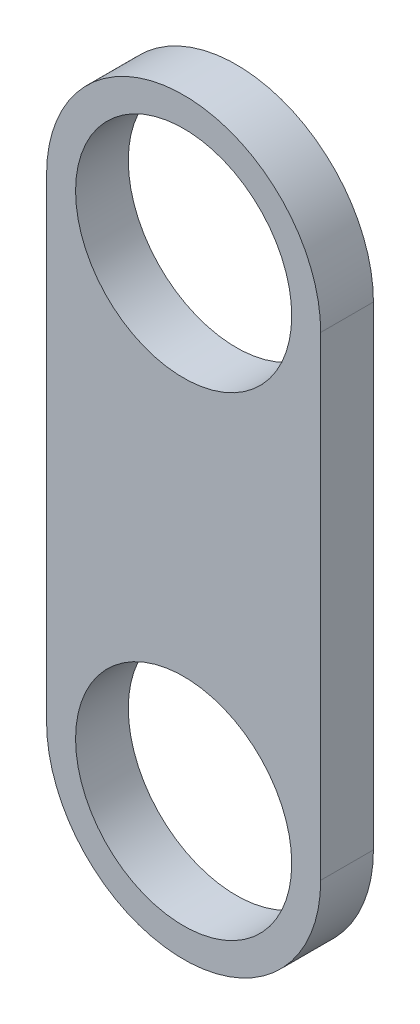
ISO-10303-21;
HEADER;
FILE_DESCRIPTION(('STEP AP214'),'2;1');
FILE_NAME('part.step','',(''),(''),'','','');
FILE_SCHEMA(('AUTOMOTIVE_DESIGN { 1 0 10303 214 1 1 1 1 }'));
ENDSEC;
DATA;
#1=APPLICATION_CONTEXT('core data for automotive mechanical design processes');
#2=APPLICATION_PROTOCOL_DEFINITION('international standard','automotive_design',2000,#1);
#3=PRODUCT_CONTEXT('',#1,'mechanical');
#4=PRODUCT('Part','Part','',(#3));
#5=PRODUCT_RELATED_PRODUCT_CATEGORY('part','',(#4));
#6=PRODUCT_DEFINITION_FORMATION('','',#4);
#7=PRODUCT_DEFINITION_CONTEXT('part definition',#1,'design');
#8=PRODUCT_DEFINITION('design','',#6,#7);
#9=PRODUCT_DEFINITION_SHAPE('','',#8);
#10=(LENGTH_UNIT() NAMED_UNIT(*) SI_UNIT(.MILLI.,.METRE.));
#11=(NAMED_UNIT(*) PLANE_ANGLE_UNIT() SI_UNIT($,.RADIAN.));
#12=(NAMED_UNIT(*) SI_UNIT($,.STERADIAN.) SOLID_ANGLE_UNIT());
#13=UNCERTAINTY_MEASURE_WITH_UNIT(LENGTH_MEASURE(1.E-05),#10,'distance_accuracy_value','');
#14=(GEOMETRIC_REPRESENTATION_CONTEXT(3) GLOBAL_UNCERTAINTY_ASSIGNED_CONTEXT((#13)) GLOBAL_UNIT_ASSIGNED_CONTEXT((#10,
#11,#12)) REPRESENTATION_CONTEXT('',''));
#15=CARTESIAN_POINT('',(0.,0.,0.));
#16=DIRECTION('',(0.,0.,1.));
#17=DIRECTION('',(1.,0.,0.));
#18=AXIS2_PLACEMENT_3D('',#15,#16,#17);
#19=CARTESIAN_POINT('',(-13.,0.,5.));
#20=DIRECTION('',(1.,0.,0.));
#21=DIRECTION('',(0.,1.,0.));
#22=AXIS2_PLACEMENT_3D('',#19,#20,#21);
#23=PLANE('',#22);
#24=DIRECTION('',(0.,-1.,0.));
#25=VECTOR('',#24,1.);
#26=CARTESIAN_POINT('',(-13.,0.,0.));
#27=LINE('',#26,#25);
#28=CARTESIAN_POINT('',(-13.,0.,0.));
#29=VERTEX_POINT('',#28);
#30=CARTESIAN_POINT('',(-13.,-45.,0.));
#31=VERTEX_POINT('',#30);
#32=EDGE_CURVE('E114',#29,#31,#27,.T.);
#33=ORIENTED_EDGE('',*,*,#32,.T.);
#34=DIRECTION('',(0.,0.,-1.));
#35=VECTOR('',#34,1.);
#36=CARTESIAN_POINT('',(-13.,-45.,5.));
#37=LINE('',#36,#35);
#38=CARTESIAN_POINT('',(-13.,-45.,5.));
#39=VERTEX_POINT('',#38);
#40=EDGE_CURVE('E11',#39,#31,#37,.T.);
#41=ORIENTED_EDGE('',*,*,#40,.F.);
#42=DIRECTION('',(0.,-1.,0.));
#43=VECTOR('',#42,1.);
#44=CARTESIAN_POINT('',(-13.,0.,5.));
#45=LINE('',#44,#43);
#46=CARTESIAN_POINT('',(-13.,0.,5.));
#47=VERTEX_POINT('',#46);
#48=EDGE_CURVE('E93',#47,#39,#45,.T.);
#49=ORIENTED_EDGE('',*,*,#48,.F.);
#50=DIRECTION('',(0.,0.,-1.));
#51=VECTOR('',#50,1.);
#52=CARTESIAN_POINT('',(-13.,0.,5.));
#53=LINE('',#52,#51);
#54=EDGE_CURVE('E104',#47,#29,#53,.T.);
#55=ORIENTED_EDGE('',*,*,#54,.T.);
#56=EDGE_LOOP('',(#33,#41,#49,#55));
#57=FACE_BOUND('',#56,.T.);
#58=ADVANCED_FACE('F45',(#57),#23,.F.);
#59=CARTESIAN_POINT('',(0.,-45.,5.));
#60=DIRECTION('',(0.,0.,-1.));
#61=DIRECTION('',(-1.,0.,0.));
#62=AXIS2_PLACEMENT_3D('',#59,#60,#61);
#63=CYLINDRICAL_SURFACE('',#62,13.);
#64=CARTESIAN_POINT('',(0.,-45.,0.));
#65=DIRECTION('',(0.,0.,1.));
#66=DIRECTION('',(1.,0.,0.));
#67=AXIS2_PLACEMENT_3D('',#64,#65,#66);
#68=CIRCLE('',#67,13.);
#69=CARTESIAN_POINT('',(13.,-45.,0.));
#70=VERTEX_POINT('',#69);
#71=EDGE_CURVE('E98',#31,#70,#68,.T.);
#72=ORIENTED_EDGE('',*,*,#71,.T.);
#73=DIRECTION('',(0.,0.,-1.));
#74=VECTOR('',#73,1.);
#75=CARTESIAN_POINT('',(13.,-45.,5.));
#76=LINE('',#75,#74);
#77=CARTESIAN_POINT('',(13.,-45.,5.));
#78=VERTEX_POINT('',#77);
#79=EDGE_CURVE('E54',#78,#70,#76,.T.);
#80=ORIENTED_EDGE('',*,*,#79,.F.);
#81=CARTESIAN_POINT('',(0.,-45.,5.));
#82=DIRECTION('',(0.,0.,1.));
#83=DIRECTION('',(1.,0.,0.));
#84=AXIS2_PLACEMENT_3D('',#81,#82,#83);
#85=CIRCLE('',#84,13.);
#86=EDGE_CURVE('E88',#39,#78,#85,.T.);
#87=ORIENTED_EDGE('',*,*,#86,.F.);
#88=ORIENTED_EDGE('',*,*,#40,.T.);
#89=EDGE_LOOP('',(#72,#80,#87,#88));
#90=FACE_BOUND('',#89,.T.);
#91=ADVANCED_FACE('F97',(#90),#63,.T.);
#92=CARTESIAN_POINT('',(13.,0.,5.));
#93=DIRECTION('',(1.,0.,0.));
#94=DIRECTION('',(0.,1.,0.));
#95=AXIS2_PLACEMENT_3D('',#92,#93,#94);
#96=PLANE('',#95);
#97=DIRECTION('',(0.,-1.,0.));
#98=VECTOR('',#97,1.);
#99=CARTESIAN_POINT('',(13.,0.,0.));
#100=LINE('',#99,#98);
#101=CARTESIAN_POINT('',(13.,0.,0.));
#102=VERTEX_POINT('',#101);
#103=EDGE_CURVE('E118',#102,#70,#100,.T.);
#104=ORIENTED_EDGE('',*,*,#103,.F.);
#105=DIRECTION('',(0.,0.,-1.));
#106=VECTOR('',#105,1.);
#107=CARTESIAN_POINT('',(13.,0.,5.));
#108=LINE('',#107,#106);
#109=CARTESIAN_POINT('',(13.,0.,5.));
#110=VERTEX_POINT('',#109);
#111=EDGE_CURVE('E78',#110,#102,#108,.T.);
#112=ORIENTED_EDGE('',*,*,#111,.F.);
#113=DIRECTION('',(0.,-1.,0.));
#114=VECTOR('',#113,1.);
#115=CARTESIAN_POINT('',(13.,0.,5.));
#116=LINE('',#115,#114);
#117=EDGE_CURVE('E91',#110,#78,#116,.T.);
#118=ORIENTED_EDGE('',*,*,#117,.T.);
#119=ORIENTED_EDGE('',*,*,#79,.T.);
#120=EDGE_LOOP('',(#104,#112,#118,#119));
#121=FACE_BOUND('',#120,.T.);
#122=ADVANCED_FACE('F102',(#121),#96,.T.);
#123=CARTESIAN_POINT('',(0.,0.,5.));
#124=DIRECTION('',(0.,0.,-1.));
#125=DIRECTION('',(-1.,0.,0.));
#126=AXIS2_PLACEMENT_3D('',#123,#124,#125);
#127=CYLINDRICAL_SURFACE('',#126,10.25);
#128=CARTESIAN_POINT('',(0.,0.,5.));
#129=DIRECTION('',(0.,0.,1.));
#130=DIRECTION('',(1.,0.,0.));
#131=AXIS2_PLACEMENT_3D('',#128,#129,#130);
#132=CIRCLE('',#131,10.25);
#133=CARTESIAN_POINT('',(10.25,0.,5.));
#134=VERTEX_POINT('',#133);
#135=EDGE_CURVE('E156',#134,#134,#132,.T.);
#136=ORIENTED_EDGE('',*,*,#135,.T.);
#137=EDGE_LOOP('',(#136));
#138=FACE_BOUND('',#137,.T.);
#139=CARTESIAN_POINT('',(0.,0.,0.));
#140=DIRECTION('',(0.,0.,1.));
#141=DIRECTION('',(1.,0.,0.));
#142=AXIS2_PLACEMENT_3D('',#139,#140,#141);
#143=CIRCLE('',#142,10.25);
#144=CARTESIAN_POINT('',(10.25,0.,0.));
#145=VERTEX_POINT('',#144);
#146=EDGE_CURVE('E111',#145,#145,#143,.T.);
#147=ORIENTED_EDGE('',*,*,#146,.F.);
#148=EDGE_LOOP('',(#147));
#149=FACE_BOUND('',#148,.T.);
#150=ADVANCED_FACE('F145',(#138,#149),#127,.F.);
#151=CARTESIAN_POINT('',(0.,-45.,5.));
#152=DIRECTION('',(0.,0.,-1.));
#153=DIRECTION('',(-1.,0.,0.));
#154=AXIS2_PLACEMENT_3D('',#151,#152,#153);
#155=CYLINDRICAL_SURFACE('',#154,10.25);
#156=CARTESIAN_POINT('',(0.,-45.,5.));
#157=DIRECTION('',(0.,0.,1.));
#158=DIRECTION('',(1.,0.,0.));
#159=AXIS2_PLACEMENT_3D('',#156,#157,#158);
#160=CIRCLE('',#159,10.25);
#161=CARTESIAN_POINT('',(10.25,-45.,5.));
#162=VERTEX_POINT('',#161);
#163=EDGE_CURVE('E121',#162,#162,#160,.T.);
#164=ORIENTED_EDGE('',*,*,#163,.T.);
#165=EDGE_LOOP('',(#164));
#166=FACE_BOUND('',#165,.T.);
#167=CARTESIAN_POINT('',(0.,-45.,0.));
#168=DIRECTION('',(0.,0.,1.));
#169=DIRECTION('',(1.,0.,0.));
#170=AXIS2_PLACEMENT_3D('',#167,#168,#169);
#171=CIRCLE('',#170,10.25);
#172=CARTESIAN_POINT('',(10.25,-45.,0.));
#173=VERTEX_POINT('',#172);
#174=EDGE_CURVE('E108',#173,#173,#171,.T.);
#175=ORIENTED_EDGE('',*,*,#174,.F.);
#176=EDGE_LOOP('',(#175));
#177=FACE_BOUND('',#176,.T.);
#178=ADVANCED_FACE('F47',(#166,#177),#155,.F.);
#179=CARTESIAN_POINT('',(0.,0.,5.));
#180=DIRECTION('',(0.,0.,-1.));
#181=DIRECTION('',(-1.,0.,0.));
#182=AXIS2_PLACEMENT_3D('',#179,#180,#181);
#183=CYLINDRICAL_SURFACE('',#182,13.);
#184=CARTESIAN_POINT('',(0.,0.,0.));
#185=DIRECTION('',(0.,0.,1.));
#186=DIRECTION('',(1.,0.,0.));
#187=AXIS2_PLACEMENT_3D('',#184,#185,#186);
#188=CIRCLE('',#187,13.);
#189=EDGE_CURVE('E81',#102,#29,#188,.T.);
#190=ORIENTED_EDGE('',*,*,#189,.T.);
#191=ORIENTED_EDGE('',*,*,#54,.F.);
#192=CARTESIAN_POINT('',(0.,0.,5.));
#193=DIRECTION('',(0.,0.,1.));
#194=DIRECTION('',(1.,0.,0.));
#195=AXIS2_PLACEMENT_3D('',#192,#193,#194);
#196=CIRCLE('',#195,13.);
#197=EDGE_CURVE('E62',#110,#47,#196,.T.);
#198=ORIENTED_EDGE('',*,*,#197,.F.);
#199=ORIENTED_EDGE('',*,*,#111,.T.);
#200=EDGE_LOOP('',(#190,#191,#198,#199));
#201=FACE_BOUND('',#200,.T.);
#202=ADVANCED_FACE('F133',(#201),#183,.T.);
#203=CARTESIAN_POINT('',(0.,0.,5.));
#204=DIRECTION('',(0.,0.,1.));
#205=DIRECTION('',(1.,0.,0.));
#206=AXIS2_PLACEMENT_3D('',#203,#204,#205);
#207=PLANE('',#206);
#208=ORIENTED_EDGE('',*,*,#163,.F.);
#209=EDGE_LOOP('',(#208));
#210=FACE_BOUND('',#209,.T.);
#211=ORIENTED_EDGE('',*,*,#135,.F.);
#212=EDGE_LOOP('',(#211));
#213=FACE_BOUND('',#212,.T.);
#214=ORIENTED_EDGE('',*,*,#48,.T.);
#215=ORIENTED_EDGE('',*,*,#86,.T.);
#216=ORIENTED_EDGE('',*,*,#117,.F.);
#217=ORIENTED_EDGE('',*,*,#197,.T.);
#218=EDGE_LOOP('',(#214,#215,#216,#217));
#219=FACE_BOUND('',#218,.T.);
#220=ADVANCED_FACE('F89',(#210,#213,#219),#207,.T.);
#221=CARTESIAN_POINT('',(0.,0.,0.));
#222=DIRECTION('',(0.,0.,1.));
#223=DIRECTION('',(1.,0.,0.));
#224=AXIS2_PLACEMENT_3D('',#221,#222,#223);
#225=PLANE('',#224);
#226=ORIENTED_EDGE('',*,*,#174,.T.);
#227=EDGE_LOOP('',(#226));
#228=FACE_BOUND('',#227,.T.);
#229=ORIENTED_EDGE('',*,*,#146,.T.);
#230=EDGE_LOOP('',(#229));
#231=FACE_BOUND('',#230,.T.);
#232=ORIENTED_EDGE('',*,*,#32,.F.);
#233=ORIENTED_EDGE('',*,*,#189,.F.);
#234=ORIENTED_EDGE('',*,*,#103,.T.);
#235=ORIENTED_EDGE('',*,*,#71,.F.);
#236=EDGE_LOOP('',(#232,#233,#234,#235));
#237=FACE_BOUND('',#236,.T.);
#238=ADVANCED_FACE('F126',(#228,#231,#237),#225,.F.);
#239=CLOSED_SHELL('',(#58,#91,#122,#150,#178,#202,#220,#238));
#240=MANIFOLD_SOLID_BREP('B2',#239);
#241=ADVANCED_BREP_SHAPE_REPRESENTATION('',(#18,#240),#14);
#242=SHAPE_DEFINITION_REPRESENTATION(#9,#241);
ENDSEC;
END-ISO-10303-21;
